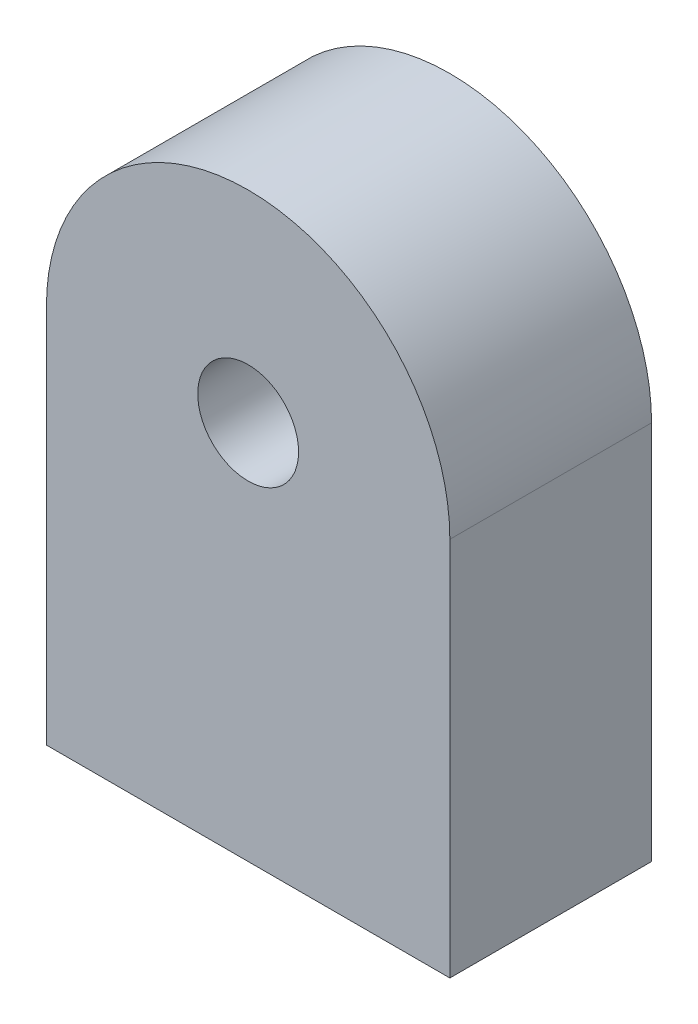
ISO-10303-21;
HEADER;
FILE_DESCRIPTION(('STEP AP214'),'2;1');
FILE_NAME('part.step','',(''),(''),'','','');
FILE_SCHEMA(('AUTOMOTIVE_DESIGN { 1 0 10303 214 1 1 1 1 }'));
ENDSEC;
DATA;
#1=APPLICATION_CONTEXT('core data for automotive mechanical design processes');
#2=APPLICATION_PROTOCOL_DEFINITION('international standard','automotive_design',2000,#1);
#3=PRODUCT_CONTEXT('',#1,'mechanical');
#4=PRODUCT('Part','Part','',(#3));
#5=PRODUCT_RELATED_PRODUCT_CATEGORY('part','',(#4));
#6=PRODUCT_DEFINITION_FORMATION('','',#4);
#7=PRODUCT_DEFINITION_CONTEXT('part definition',#1,'design');
#8=PRODUCT_DEFINITION('design','',#6,#7);
#9=PRODUCT_DEFINITION_SHAPE('','',#8);
#10=(LENGTH_UNIT() NAMED_UNIT(*) SI_UNIT(.MILLI.,.METRE.));
#11=(NAMED_UNIT(*) PLANE_ANGLE_UNIT() SI_UNIT($,.RADIAN.));
#12=(NAMED_UNIT(*) SI_UNIT($,.STERADIAN.) SOLID_ANGLE_UNIT());
#13=UNCERTAINTY_MEASURE_WITH_UNIT(LENGTH_MEASURE(1.E-05),#10,'distance_accuracy_value','');
#14=(GEOMETRIC_REPRESENTATION_CONTEXT(3) GLOBAL_UNCERTAINTY_ASSIGNED_CONTEXT((#13)) GLOBAL_UNIT_ASSIGNED_CONTEXT((#10,
#11,#12)) REPRESENTATION_CONTEXT('',''));
#15=CARTESIAN_POINT('',(0.,0.,0.));
#16=DIRECTION('',(0.,0.,1.));
#17=DIRECTION('',(1.,0.,0.));
#18=AXIS2_PLACEMENT_3D('',#15,#16,#17);
#19=CARTESIAN_POINT('',(0.,0.,25.4));
#20=DIRECTION('',(0.,0.,1.));
#21=DIRECTION('',(1.,0.,0.));
#22=AXIS2_PLACEMENT_3D('',#19,#20,#21);
#23=PLANE('',#22);
#24=CARTESIAN_POINT('',(0.,0.,25.4));
#25=DIRECTION('',(0.,0.,1.));
#26=DIRECTION('',(1.,0.,0.));
#27=AXIS2_PLACEMENT_3D('',#24,#25,#26);
#28=CIRCLE('',#27,25.4);
#29=CARTESIAN_POINT('',(25.4,0.,25.4));
#30=VERTEX_POINT('',#29);
#31=CARTESIAN_POINT('',(-25.4,0.,25.4));
#32=VERTEX_POINT('',#31);
#33=EDGE_CURVE('E84',#30,#32,#28,.T.);
#34=ORIENTED_EDGE('',*,*,#33,.T.);
#35=DIRECTION('',(0.,-1.,0.));
#36=VECTOR('',#35,1.);
#37=CARTESIAN_POINT('',(-25.4,0.,25.4));
#38=LINE('',#37,#36);
#39=CARTESIAN_POINT('',(-25.4,-47.8423102027003,25.4));
#40=VERTEX_POINT('',#39);
#41=EDGE_CURVE('E79',#32,#40,#38,.T.);
#42=ORIENTED_EDGE('',*,*,#41,.T.);
#43=DIRECTION('',(1.,0.,0.));
#44=VECTOR('',#43,1.);
#45=CARTESIAN_POINT('',(-25.4,-47.8423102027003,25.4));
#46=LINE('',#45,#44);
#47=CARTESIAN_POINT('',(25.4,-47.8423102027003,25.4));
#48=VERTEX_POINT('',#47);
#49=EDGE_CURVE('E82',#40,#48,#46,.T.);
#50=ORIENTED_EDGE('',*,*,#49,.T.);
#51=DIRECTION('',(0.,1.,0.));
#52=VECTOR('',#51,1.);
#53=CARTESIAN_POINT('',(25.4,-47.8423102027003,25.4));
#54=LINE('',#53,#52);
#55=EDGE_CURVE('E49',#48,#30,#54,.T.);
#56=ORIENTED_EDGE('',*,*,#55,.T.);
#57=EDGE_LOOP('',(#34,#42,#50,#56));
#58=FACE_BOUND('',#57,.T.);
#59=CARTESIAN_POINT('',(0.,0.,25.4));
#60=DIRECTION('',(0.,0.,1.));
#61=DIRECTION('',(1.,0.,0.));
#62=AXIS2_PLACEMENT_3D('',#59,#60,#61);
#63=CIRCLE('',#62,6.35);
#64=CARTESIAN_POINT('',(6.35,0.,25.4));
#65=VERTEX_POINT('',#64);
#66=EDGE_CURVE('E99',#65,#65,#63,.T.);
#67=ORIENTED_EDGE('',*,*,#66,.F.);
#68=EDGE_LOOP('',(#67));
#69=FACE_BOUND('',#68,.T.);
#70=ADVANCED_FACE('F32',(#58,#69),#23,.T.);
#71=CARTESIAN_POINT('',(0.,0.,0.));
#72=DIRECTION('',(0.,0.,1.));
#73=DIRECTION('',(1.,0.,0.));
#74=AXIS2_PLACEMENT_3D('',#71,#72,#73);
#75=PLANE('',#74);
#76=CARTESIAN_POINT('',(0.,0.,0.));
#77=DIRECTION('',(0.,0.,1.));
#78=DIRECTION('',(1.,0.,0.));
#79=AXIS2_PLACEMENT_3D('',#76,#77,#78);
#80=CIRCLE('',#79,25.4);
#81=CARTESIAN_POINT('',(25.4,0.,0.));
#82=VERTEX_POINT('',#81);
#83=CARTESIAN_POINT('',(-25.4,0.,0.));
#84=VERTEX_POINT('',#83);
#85=EDGE_CURVE('E96',#82,#84,#80,.T.);
#86=ORIENTED_EDGE('',*,*,#85,.F.);
#87=DIRECTION('',(0.,1.,0.));
#88=VECTOR('',#87,1.);
#89=CARTESIAN_POINT('',(25.4,-47.8423102027003,0.));
#90=LINE('',#89,#88);
#91=CARTESIAN_POINT('',(25.4,-47.8423102027003,0.));
#92=VERTEX_POINT('',#91);
#93=EDGE_CURVE('E72',#92,#82,#90,.T.);
#94=ORIENTED_EDGE('',*,*,#93,.F.);
#95=DIRECTION('',(1.,0.,0.));
#96=VECTOR('',#95,1.);
#97=CARTESIAN_POINT('',(-25.4,-47.8423102027003,0.));
#98=LINE('',#97,#96);
#99=CARTESIAN_POINT('',(-25.4,-47.8423102027003,0.));
#100=VERTEX_POINT('',#99);
#101=EDGE_CURVE('E66',#100,#92,#98,.T.);
#102=ORIENTED_EDGE('',*,*,#101,.F.);
#103=DIRECTION('',(0.,-1.,0.));
#104=VECTOR('',#103,1.);
#105=CARTESIAN_POINT('',(-25.4,0.,0.));
#106=LINE('',#105,#104);
#107=EDGE_CURVE('E88',#84,#100,#106,.T.);
#108=ORIENTED_EDGE('',*,*,#107,.F.);
#109=EDGE_LOOP('',(#86,#94,#102,#108));
#110=FACE_BOUND('',#109,.T.);
#111=CARTESIAN_POINT('',(0.,0.,0.));
#112=DIRECTION('',(0.,0.,1.));
#113=DIRECTION('',(1.,0.,0.));
#114=AXIS2_PLACEMENT_3D('',#111,#112,#113);
#115=CIRCLE('',#114,6.35);
#116=CARTESIAN_POINT('',(6.35,0.,0.));
#117=VERTEX_POINT('',#116);
#118=EDGE_CURVE('E111',#117,#117,#115,.T.);
#119=ORIENTED_EDGE('',*,*,#118,.T.);
#120=EDGE_LOOP('',(#119));
#121=FACE_BOUND('',#120,.T.);
#122=ADVANCED_FACE('F107',(#110,#121),#75,.F.);
#123=CARTESIAN_POINT('',(0.,0.,25.4));
#124=DIRECTION('',(0.,0.,-1.));
#125=DIRECTION('',(-1.,0.,0.));
#126=AXIS2_PLACEMENT_3D('',#123,#124,#125);
#127=CYLINDRICAL_SURFACE('',#126,25.4);
#128=ORIENTED_EDGE('',*,*,#85,.T.);
#129=DIRECTION('',(0.,0.,-1.));
#130=VECTOR('',#129,1.);
#131=CARTESIAN_POINT('',(-25.4,0.,25.4));
#132=LINE('',#131,#130);
#133=EDGE_CURVE('E11',#32,#84,#132,.T.);
#134=ORIENTED_EDGE('',*,*,#133,.F.);
#135=ORIENTED_EDGE('',*,*,#33,.F.);
#136=DIRECTION('',(0.,0.,-1.));
#137=VECTOR('',#136,1.);
#138=CARTESIAN_POINT('',(25.4,0.,25.4));
#139=LINE('',#138,#137);
#140=EDGE_CURVE('E92',#30,#82,#139,.T.);
#141=ORIENTED_EDGE('',*,*,#140,.T.);
#142=EDGE_LOOP('',(#128,#134,#135,#141));
#143=FACE_BOUND('',#142,.T.);
#144=ADVANCED_FACE('F34',(#143),#127,.T.);
#145=CARTESIAN_POINT('',(-25.4,0.,25.4));
#146=DIRECTION('',(1.,0.,0.));
#147=DIRECTION('',(0.,0.,-1.));
#148=AXIS2_PLACEMENT_3D('',#145,#146,#147);
#149=PLANE('',#148);
#150=ORIENTED_EDGE('',*,*,#107,.T.);
#151=DIRECTION('',(0.,0.,-1.));
#152=VECTOR('',#151,1.);
#153=CARTESIAN_POINT('',(-25.4,-47.8423102027003,25.4));
#154=LINE('',#153,#152);
#155=EDGE_CURVE('E41',#40,#100,#154,.T.);
#156=ORIENTED_EDGE('',*,*,#155,.F.);
#157=ORIENTED_EDGE('',*,*,#41,.F.);
#158=ORIENTED_EDGE('',*,*,#133,.T.);
#159=EDGE_LOOP('',(#150,#156,#157,#158));
#160=FACE_BOUND('',#159,.T.);
#161=ADVANCED_FACE('F87',(#160),#149,.F.);
#162=CARTESIAN_POINT('',(-25.4,-47.8423102027003,25.4));
#163=DIRECTION('',(0.,1.,0.));
#164=DIRECTION('',(0.,0.,1.));
#165=AXIS2_PLACEMENT_3D('',#162,#163,#164);
#166=PLANE('',#165);
#167=ORIENTED_EDGE('',*,*,#101,.T.);
#168=DIRECTION('',(0.,0.,-1.));
#169=VECTOR('',#168,1.);
#170=CARTESIAN_POINT('',(25.4,-47.8423102027003,25.4));
#171=LINE('',#170,#169);
#172=EDGE_CURVE('E89',#48,#92,#171,.T.);
#173=ORIENTED_EDGE('',*,*,#172,.F.);
#174=ORIENTED_EDGE('',*,*,#49,.F.);
#175=ORIENTED_EDGE('',*,*,#155,.T.);
#176=EDGE_LOOP('',(#167,#173,#174,#175));
#177=FACE_BOUND('',#176,.T.);
#178=ADVANCED_FACE('F90',(#177),#166,.F.);
#179=CARTESIAN_POINT('',(25.4,-47.8423102027003,25.4));
#180=DIRECTION('',(-1.,0.,0.));
#181=DIRECTION('',(0.,0.,1.));
#182=AXIS2_PLACEMENT_3D('',#179,#180,#181);
#183=PLANE('',#182);
#184=ORIENTED_EDGE('',*,*,#93,.T.);
#185=ORIENTED_EDGE('',*,*,#140,.F.);
#186=ORIENTED_EDGE('',*,*,#55,.F.);
#187=ORIENTED_EDGE('',*,*,#172,.T.);
#188=EDGE_LOOP('',(#184,#185,#186,#187));
#189=FACE_BOUND('',#188,.T.);
#190=ADVANCED_FACE('F104',(#189),#183,.F.);
#191=CARTESIAN_POINT('',(0.,0.,25.4));
#192=DIRECTION('',(0.,0.,-1.));
#193=DIRECTION('',(-1.,0.,0.));
#194=AXIS2_PLACEMENT_3D('',#191,#192,#193);
#195=CYLINDRICAL_SURFACE('',#194,6.35);
#196=ORIENTED_EDGE('',*,*,#66,.T.);
#197=EDGE_LOOP('',(#196));
#198=FACE_BOUND('',#197,.T.);
#199=ORIENTED_EDGE('',*,*,#118,.F.);
#200=EDGE_LOOP('',(#199));
#201=FACE_BOUND('',#200,.T.);
#202=ADVANCED_FACE('F117',(#198,#201),#195,.F.);
#203=CLOSED_SHELL('',(#70,#122,#144,#161,#178,#190,#202));
#204=MANIFOLD_SOLID_BREP('B2',#203);
#205=ADVANCED_BREP_SHAPE_REPRESENTATION('',(#18,#204),#14);
#206=SHAPE_DEFINITION_REPRESENTATION(#9,#205);
ENDSEC;
END-ISO-10303-21;
